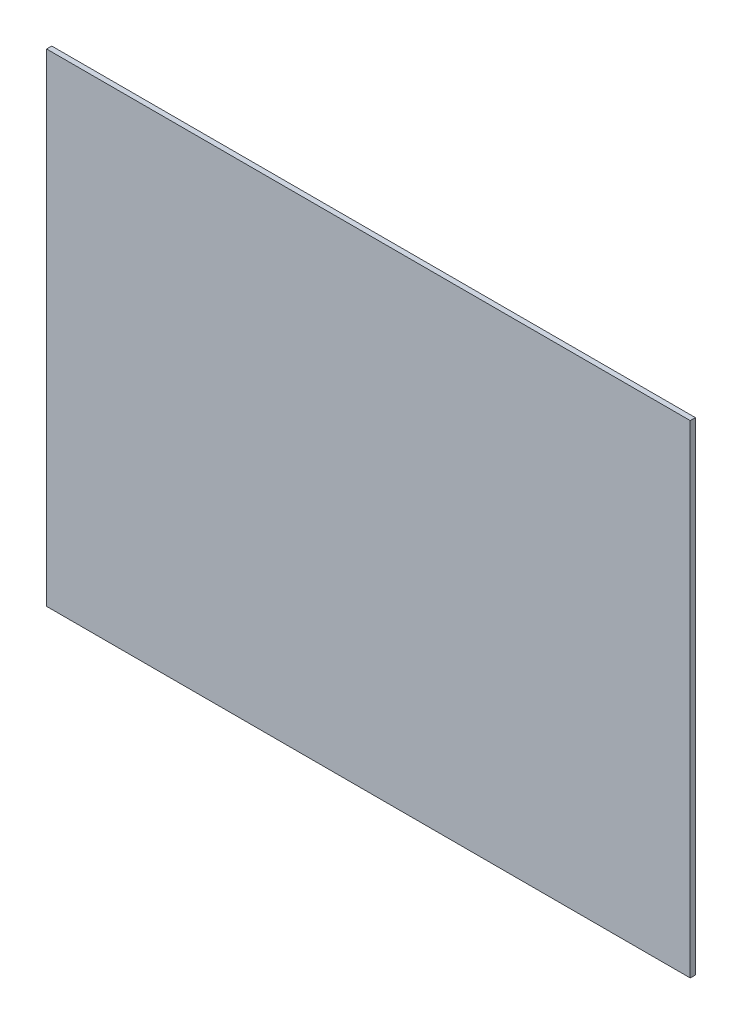
ISO-10303-21;
HEADER;
FILE_DESCRIPTION(('STEP AP214'),'2;1');
FILE_NAME('part.step','',(''),(''),'','','');
FILE_SCHEMA(('AUTOMOTIVE_DESIGN { 1 0 10303 214 1 1 1 1 }'));
ENDSEC;
DATA;
#1=APPLICATION_CONTEXT('core data for automotive mechanical design processes');
#2=APPLICATION_PROTOCOL_DEFINITION('international standard','automotive_design',2000,#1);
#3=PRODUCT_CONTEXT('',#1,'mechanical');
#4=PRODUCT('Part','Part','',(#3));
#5=PRODUCT_RELATED_PRODUCT_CATEGORY('part','',(#4));
#6=PRODUCT_DEFINITION_FORMATION('','',#4);
#7=PRODUCT_DEFINITION_CONTEXT('part definition',#1,'design');
#8=PRODUCT_DEFINITION('design','',#6,#7);
#9=PRODUCT_DEFINITION_SHAPE('','',#8);
#10=(LENGTH_UNIT() NAMED_UNIT(*) SI_UNIT(.MILLI.,.METRE.));
#11=(NAMED_UNIT(*) PLANE_ANGLE_UNIT() SI_UNIT($,.RADIAN.));
#12=(NAMED_UNIT(*) SI_UNIT($,.STERADIAN.) SOLID_ANGLE_UNIT());
#13=UNCERTAINTY_MEASURE_WITH_UNIT(LENGTH_MEASURE(1.E-05),#10,'distance_accuracy_value','');
#14=(GEOMETRIC_REPRESENTATION_CONTEXT(3) GLOBAL_UNCERTAINTY_ASSIGNED_CONTEXT((#13)) GLOBAL_UNIT_ASSIGNED_CONTEXT((#10,
#11,#12)) REPRESENTATION_CONTEXT('',''));
#15=CARTESIAN_POINT('',(0.,0.,0.));
#16=DIRECTION('',(0.,0.,1.));
#17=DIRECTION('',(1.,0.,0.));
#18=AXIS2_PLACEMENT_3D('',#15,#16,#17);
#19=CARTESIAN_POINT('',(1000.,-750.,16.));
#20=DIRECTION('',(-1.,0.,0.));
#21=DIRECTION('',(0.,0.,1.));
#22=AXIS2_PLACEMENT_3D('',#19,#20,#21);
#23=PLANE('',#22);
#24=DIRECTION('',(0.,1.,0.));
#25=VECTOR('',#24,1.);
#26=CARTESIAN_POINT('',(1000.,-750.,0.));
#27=LINE('',#26,#25);
#28=CARTESIAN_POINT('',(1000.,-750.,0.));
#29=VERTEX_POINT('',#28);
#30=CARTESIAN_POINT('',(1000.,750.,0.));
#31=VERTEX_POINT('',#30);
#32=EDGE_CURVE('E96',#29,#31,#27,.T.);
#33=ORIENTED_EDGE('',*,*,#32,.T.);
#34=DIRECTION('',(0.,0.,-1.));
#35=VECTOR('',#34,1.);
#36=CARTESIAN_POINT('',(1000.,750.,16.));
#37=LINE('',#36,#35);
#38=CARTESIAN_POINT('',(1000.,750.,16.));
#39=VERTEX_POINT('',#38);
#40=EDGE_CURVE('E11',#39,#31,#37,.T.);
#41=ORIENTED_EDGE('',*,*,#40,.F.);
#42=DIRECTION('',(0.,1.,0.));
#43=VECTOR('',#42,1.);
#44=CARTESIAN_POINT('',(1000.,-750.,16.));
#45=LINE('',#44,#43);
#46=CARTESIAN_POINT('',(1000.,-750.,16.));
#47=VERTEX_POINT('',#46);
#48=EDGE_CURVE('E84',#47,#39,#45,.T.);
#49=ORIENTED_EDGE('',*,*,#48,.F.);
#50=DIRECTION('',(0.,0.,-1.));
#51=VECTOR('',#50,1.);
#52=CARTESIAN_POINT('',(1000.,-750.,16.));
#53=LINE('',#52,#51);
#54=EDGE_CURVE('E92',#47,#29,#53,.T.);
#55=ORIENTED_EDGE('',*,*,#54,.T.);
#56=EDGE_LOOP('',(#33,#41,#49,#55));
#57=FACE_BOUND('',#56,.T.);
#58=ADVANCED_FACE('F33',(#57),#23,.F.);
#59=CARTESIAN_POINT('',(-1000.,750.,16.));
#60=DIRECTION('',(0.,-1.,0.));
#61=DIRECTION('',(0.,0.,-1.));
#62=AXIS2_PLACEMENT_3D('',#59,#60,#61);
#63=PLANE('',#62);
#64=DIRECTION('',(-1.,0.,0.));
#65=VECTOR('',#64,1.);
#66=CARTESIAN_POINT('',(-1000.,750.,0.));
#67=LINE('',#66,#65);
#68=CARTESIAN_POINT('',(-1000.,750.,0.));
#69=VERTEX_POINT('',#68);
#70=EDGE_CURVE('E88',#31,#69,#67,.T.);
#71=ORIENTED_EDGE('',*,*,#70,.T.);
#72=DIRECTION('',(0.,0.,-1.));
#73=VECTOR('',#72,1.);
#74=CARTESIAN_POINT('',(-1000.,750.,16.));
#75=LINE('',#74,#73);
#76=CARTESIAN_POINT('',(-1000.,750.,16.));
#77=VERTEX_POINT('',#76);
#78=EDGE_CURVE('E41',#77,#69,#75,.T.);
#79=ORIENTED_EDGE('',*,*,#78,.F.);
#80=DIRECTION('',(-1.,0.,0.));
#81=VECTOR('',#80,1.);
#82=CARTESIAN_POINT('',(-1000.,750.,16.));
#83=LINE('',#82,#81);
#84=EDGE_CURVE('E79',#39,#77,#83,.T.);
#85=ORIENTED_EDGE('',*,*,#84,.F.);
#86=ORIENTED_EDGE('',*,*,#40,.T.);
#87=EDGE_LOOP('',(#71,#79,#85,#86));
#88=FACE_BOUND('',#87,.T.);
#89=ADVANCED_FACE('F87',(#88),#63,.F.);
#90=CARTESIAN_POINT('',(-1000.,-750.,16.));
#91=DIRECTION('',(1.,0.,0.));
#92=DIRECTION('',(0.,0.,-1.));
#93=AXIS2_PLACEMENT_3D('',#90,#91,#92);
#94=PLANE('',#93);
#95=DIRECTION('',(0.,-1.,0.));
#96=VECTOR('',#95,1.);
#97=CARTESIAN_POINT('',(-1000.,-750.,0.));
#98=LINE('',#97,#96);
#99=CARTESIAN_POINT('',(-1000.,-750.,0.));
#100=VERTEX_POINT('',#99);
#101=EDGE_CURVE('E66',#69,#100,#98,.T.);
#102=ORIENTED_EDGE('',*,*,#101,.T.);
#103=DIRECTION('',(0.,0.,-1.));
#104=VECTOR('',#103,1.);
#105=CARTESIAN_POINT('',(-1000.,-750.,16.));
#106=LINE('',#105,#104);
#107=CARTESIAN_POINT('',(-1000.,-750.,16.));
#108=VERTEX_POINT('',#107);
#109=EDGE_CURVE('E89',#108,#100,#106,.T.);
#110=ORIENTED_EDGE('',*,*,#109,.F.);
#111=DIRECTION('',(0.,-1.,0.));
#112=VECTOR('',#111,1.);
#113=CARTESIAN_POINT('',(-1000.,-750.,16.));
#114=LINE('',#113,#112);
#115=EDGE_CURVE('E82',#77,#108,#114,.T.);
#116=ORIENTED_EDGE('',*,*,#115,.F.);
#117=ORIENTED_EDGE('',*,*,#78,.T.);
#118=EDGE_LOOP('',(#102,#110,#116,#117));
#119=FACE_BOUND('',#118,.T.);
#120=ADVANCED_FACE('F90',(#119),#94,.F.);
#121=CARTESIAN_POINT('',(-1000.,-750.,16.));
#122=DIRECTION('',(0.,1.,0.));
#123=DIRECTION('',(0.,0.,1.));
#124=AXIS2_PLACEMENT_3D('',#121,#122,#123);
#125=PLANE('',#124);
#126=DIRECTION('',(1.,0.,0.));
#127=VECTOR('',#126,1.);
#128=CARTESIAN_POINT('',(-1000.,-750.,0.));
#129=LINE('',#128,#127);
#130=EDGE_CURVE('E72',#100,#29,#129,.T.);
#131=ORIENTED_EDGE('',*,*,#130,.T.);
#132=ORIENTED_EDGE('',*,*,#54,.F.);
#133=DIRECTION('',(1.,0.,0.));
#134=VECTOR('',#133,1.);
#135=CARTESIAN_POINT('',(-1000.,-750.,16.));
#136=LINE('',#135,#134);
#137=EDGE_CURVE('E49',#108,#47,#136,.T.);
#138=ORIENTED_EDGE('',*,*,#137,.F.);
#139=ORIENTED_EDGE('',*,*,#109,.T.);
#140=EDGE_LOOP('',(#131,#132,#138,#139));
#141=FACE_BOUND('',#140,.T.);
#142=ADVANCED_FACE('F103',(#141),#125,.F.);
#143=CARTESIAN_POINT('',(0.,0.,16.));
#144=DIRECTION('',(0.,0.,-1.));
#145=DIRECTION('',(-1.,0.,0.));
#146=AXIS2_PLACEMENT_3D('',#143,#144,#145);
#147=PLANE('',#146);
#148=ORIENTED_EDGE('',*,*,#48,.T.);
#149=ORIENTED_EDGE('',*,*,#84,.T.);
#150=ORIENTED_EDGE('',*,*,#115,.T.);
#151=ORIENTED_EDGE('',*,*,#137,.T.);
#152=EDGE_LOOP('',(#148,#149,#150,#151));
#153=FACE_BOUND('',#152,.T.);
#154=ADVANCED_FACE('F80',(#153),#147,.F.);
#155=CARTESIAN_POINT('',(0.,0.,0.));
#156=DIRECTION('',(0.,0.,-1.));
#157=DIRECTION('',(-1.,0.,0.));
#158=AXIS2_PLACEMENT_3D('',#155,#156,#157);
#159=PLANE('',#158);
#160=ORIENTED_EDGE('',*,*,#32,.F.);
#161=ORIENTED_EDGE('',*,*,#130,.F.);
#162=ORIENTED_EDGE('',*,*,#101,.F.);
#163=ORIENTED_EDGE('',*,*,#70,.F.);
#164=EDGE_LOOP('',(#160,#161,#162,#163));
#165=FACE_BOUND('',#164,.T.);
#166=ADVANCED_FACE('F106',(#165),#159,.T.);
#167=CLOSED_SHELL('',(#58,#89,#120,#142,#154,#166));
#168=MANIFOLD_SOLID_BREP('B2',#167);
#169=ADVANCED_BREP_SHAPE_REPRESENTATION('',(#18,#168),#14);
#170=SHAPE_DEFINITION_REPRESENTATION(#9,#169);
ENDSEC;
END-ISO-10303-21;
